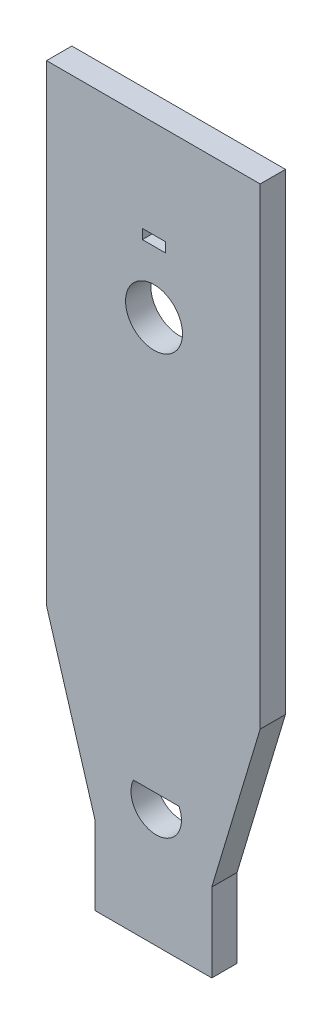
ISO-10303-21;
HEADER;
FILE_DESCRIPTION(('STEP AP214'),'2;1');
FILE_NAME('part.step','',(''),(''),'','','');
FILE_SCHEMA(('AUTOMOTIVE_DESIGN { 1 0 10303 214 1 1 1 1 }'));
ENDSEC;
DATA;
#1=APPLICATION_CONTEXT('core data for automotive mechanical design processes');
#2=APPLICATION_PROTOCOL_DEFINITION('international standard','automotive_design',2000,#1);
#3=PRODUCT_CONTEXT('',#1,'mechanical');
#4=PRODUCT('Part','Part','',(#3));
#5=PRODUCT_RELATED_PRODUCT_CATEGORY('part','',(#4));
#6=PRODUCT_DEFINITION_FORMATION('','',#4);
#7=PRODUCT_DEFINITION_CONTEXT('part definition',#1,'design');
#8=PRODUCT_DEFINITION('design','',#6,#7);
#9=PRODUCT_DEFINITION_SHAPE('','',#8);
#10=(LENGTH_UNIT() NAMED_UNIT(*) SI_UNIT(.MILLI.,.METRE.));
#11=(NAMED_UNIT(*) PLANE_ANGLE_UNIT() SI_UNIT($,.RADIAN.));
#12=(NAMED_UNIT(*) SI_UNIT($,.STERADIAN.) SOLID_ANGLE_UNIT());
#13=UNCERTAINTY_MEASURE_WITH_UNIT(LENGTH_MEASURE(1.E-05),#10,'distance_accuracy_value','');
#14=(GEOMETRIC_REPRESENTATION_CONTEXT(3) GLOBAL_UNCERTAINTY_ASSIGNED_CONTEXT((#13)) GLOBAL_UNIT_ASSIGNED_CONTEXT((#10,
#11,#12)) REPRESENTATION_CONTEXT('',''));
#15=CARTESIAN_POINT('',(0.,0.,0.));
#16=DIRECTION('',(0.,0.,1.));
#17=DIRECTION('',(1.,0.,0.));
#18=AXIS2_PLACEMENT_3D('',#15,#16,#17);
#19=CARTESIAN_POINT('',(0.,0.,0.));
#20=DIRECTION('',(0.,0.,1.));
#21=DIRECTION('',(1.,0.,0.));
#22=AXIS2_PLACEMENT_3D('',#19,#20,#21);
#23=PLANE('',#22);
#24=CARTESIAN_POINT('',(-356.8563,181.549003721827,0.));
#25=DIRECTION('',(0.,0.,1.));
#26=DIRECTION('',(1.,0.,0.));
#27=AXIS2_PLACEMENT_3D('',#24,#25,#26);
#28=CIRCLE('',#27,2.99300991085732);
#29=CARTESIAN_POINT('',(-354.1563,182.84055640232,0.));
#30=VERTEX_POINT('',#29);
#31=CARTESIAN_POINT('',(-359.5563,182.84055640232,0.));
#32=VERTEX_POINT('',#31);
#33=EDGE_CURVE('E209',#30,#32,#28,.F.);
#34=ORIENTED_EDGE('',*,*,#33,.F.);
#35=DIRECTION('',(1.,0.,0.));
#36=VECTOR('',#35,1.);
#37=CARTESIAN_POINT('',(0.,182.84055640232,0.));
#38=LINE('',#37,#36);
#39=EDGE_CURVE('E207',#32,#30,#38,.T.);
#40=ORIENTED_EDGE('',*,*,#39,.F.);
#41=EDGE_LOOP('',(#34,#40));
#42=FACE_BOUND('',#41,.T.);
#43=CARTESIAN_POINT('',(-357.117541936033,231.555994220096,0.));
#44=DIRECTION('',(0.,0.,1.));
#45=DIRECTION('',(1.,0.,0.));
#46=AXIS2_PLACEMENT_3D('',#43,#44,#45);
#47=CIRCLE('',#46,3.37500000000001);
#48=CARTESIAN_POINT('',(-353.742541936033,231.555994220096,0.));
#49=VERTEX_POINT('',#48);
#50=EDGE_CURVE('E212',#49,#49,#47,.T.);
#51=ORIENTED_EDGE('',*,*,#50,.T.);
#52=EDGE_LOOP('',(#51));
#53=FACE_BOUND('',#52,.T.);
#54=DIRECTION('',(0.,-1.,0.));
#55=VECTOR('',#54,1.);
#56=CARTESIAN_POINT('',(-350.267177449582,2.08209436882162E-12,0.));
#57=LINE('',#56,#55);
#58=CARTESIAN_POINT('',(-350.267177449581,176.492478394456,0.));
#59=VERTEX_POINT('',#58);
#60=CARTESIAN_POINT('',(-350.267177449581,167.153932289193,0.));
#61=VERTEX_POINT('',#60);
#62=EDGE_CURVE('E243',#59,#61,#57,.T.);
#63=ORIENTED_EDGE('',*,*,#62,.T.);
#64=DIRECTION('',(1.,0.,0.));
#65=VECTOR('',#64,1.);
#66=CARTESIAN_POINT('',(0.,167.153932289193,0.));
#67=LINE('',#66,#65);
#68=CARTESIAN_POINT('',(-364.123724325274,167.153932289193,0.));
#69=VERTEX_POINT('',#68);
#70=EDGE_CURVE('E217',#69,#61,#67,.T.);
#71=ORIENTED_EDGE('',*,*,#70,.F.);
#72=DIRECTION('',(0.,-1.,0.));
#73=VECTOR('',#72,1.);
#74=CARTESIAN_POINT('',(-364.123724325274,0.,0.));
#75=LINE('',#74,#73);
#76=CARTESIAN_POINT('',(-364.123724325274,176.492478394456,0.));
#77=VERTEX_POINT('',#76);
#78=EDGE_CURVE('E261',#77,#69,#75,.T.);
#79=ORIENTED_EDGE('',*,*,#78,.F.);
#80=DIRECTION('',(-0.287809224056428,0.957687762555227,0.));
#81=VECTOR('',#80,1.);
#82=CARTESIAN_POINT('',(-285.314981388082,-85.7443173189158,0.));
#83=LINE('',#82,#81);
#84=CARTESIAN_POINT('',(-369.858869661342,195.57622570254,0.));
#85=VERTEX_POINT('',#84);
#86=EDGE_CURVE('E258',#77,#85,#83,.T.);
#87=ORIENTED_EDGE('',*,*,#86,.T.);
#88=DIRECTION('',(0.,1.,0.));
#89=VECTOR('',#88,1.);
#90=CARTESIAN_POINT('',(-369.858869661342,0.,0.));
#91=LINE('',#90,#89);
#92=CARTESIAN_POINT('',(-369.858869661342,251.555994220096,0.));
#93=VERTEX_POINT('',#92);
#94=EDGE_CURVE('E255',#85,#93,#91,.T.);
#95=ORIENTED_EDGE('',*,*,#94,.T.);
#96=DIRECTION('',(1.,0.,0.));
#97=VECTOR('',#96,1.);
#98=CARTESIAN_POINT('',(0.,251.555994220096,0.));
#99=LINE('',#98,#97);
#100=CARTESIAN_POINT('',(-344.532032113513,251.555994220096,0.));
#101=VERTEX_POINT('',#100);
#102=EDGE_CURVE('E252',#93,#101,#99,.T.);
#103=ORIENTED_EDGE('',*,*,#102,.T.);
#104=DIRECTION('',(0.,-1.,0.));
#105=VECTOR('',#104,1.);
#106=CARTESIAN_POINT('',(-344.532032113513,0.,0.));
#107=LINE('',#106,#105);
#108=CARTESIAN_POINT('',(-344.532032113513,195.57622570254,0.));
#109=VERTEX_POINT('',#108);
#110=EDGE_CURVE('E249',#101,#109,#107,.T.);
#111=ORIENTED_EDGE('',*,*,#110,.T.);
#112=DIRECTION('',(-0.287809224056425,-0.957687762555228,0.));
#113=VECTOR('',#112,1.);
#114=CARTESIAN_POINT('',(-369.899957662033,111.164226959697,0.));
#115=LINE('',#114,#113);
#116=EDGE_CURVE('E246',#109,#59,#115,.T.);
#117=ORIENTED_EDGE('',*,*,#116,.T.);
#118=EDGE_LOOP('',(#63,#71,#79,#87,#95,#103,#111,#117));
#119=FACE_BOUND('',#118,.T.);
#120=DIRECTION('',(0.,1.,0.));
#121=VECTOR('',#120,1.);
#122=CARTESIAN_POINT('',(-358.497541936033,0.,0.));
#123=LINE('',#122,#121);
#124=CARTESIAN_POINT('',(-358.497541936033,238.859089806921,0.));
#125=VERTEX_POINT('',#124);
#126=CARTESIAN_POINT('',(-358.497541936033,240.009089806921,0.));
#127=VERTEX_POINT('',#126);
#128=EDGE_CURVE('E195',#125,#127,#123,.T.);
#129=ORIENTED_EDGE('',*,*,#128,.F.);
#130=DIRECTION('',(-1.,0.,0.));
#131=VECTOR('',#130,1.);
#132=CARTESIAN_POINT('',(0.,238.859089806921,0.));
#133=LINE('',#132,#131);
#134=CARTESIAN_POINT('',(-355.737541936033,238.859089806921,0.));
#135=VERTEX_POINT('',#134);
#136=EDGE_CURVE('E176',#135,#125,#133,.T.);
#137=ORIENTED_EDGE('',*,*,#136,.F.);
#138=DIRECTION('',(0.,-1.,0.));
#139=VECTOR('',#138,1.);
#140=CARTESIAN_POINT('',(-355.737541936033,0.,0.));
#141=LINE('',#140,#139);
#142=CARTESIAN_POINT('',(-355.737541936033,240.009089806921,0.));
#143=VERTEX_POINT('',#142);
#144=EDGE_CURVE('E192',#143,#135,#141,.T.);
#145=ORIENTED_EDGE('',*,*,#144,.F.);
#146=DIRECTION('',(1.,0.,0.));
#147=VECTOR('',#146,1.);
#148=CARTESIAN_POINT('',(0.,240.009089806921,0.));
#149=LINE('',#148,#147);
#150=EDGE_CURVE('E177',#127,#143,#149,.T.);
#151=ORIENTED_EDGE('',*,*,#150,.F.);
#152=EDGE_LOOP('',(#129,#137,#145,#151));
#153=FACE_BOUND('',#152,.T.);
#154=ADVANCED_FACE('F62',(#42,#53,#119,#153),#23,.F.);
#155=CARTESIAN_POINT('',(0.,0.,3.));
#156=DIRECTION('',(0.,0.,1.));
#157=DIRECTION('',(1.,0.,0.));
#158=AXIS2_PLACEMENT_3D('',#155,#156,#157);
#159=PLANE('',#158);
#160=DIRECTION('',(-1.,0.,0.));
#161=VECTOR('',#160,1.);
#162=CARTESIAN_POINT('',(-359.5563,182.84055640232,3.));
#163=LINE('',#162,#161);
#164=CARTESIAN_POINT('',(-354.1563,182.84055640232,3.));
#165=VERTEX_POINT('',#164);
#166=CARTESIAN_POINT('',(-359.5563,182.84055640232,3.));
#167=VERTEX_POINT('',#166);
#168=EDGE_CURVE('E200',#165,#167,#163,.T.);
#169=ORIENTED_EDGE('',*,*,#168,.F.);
#170=CARTESIAN_POINT('',(-356.8563,181.549003721827,3.));
#171=DIRECTION('',(0.,0.,1.));
#172=DIRECTION('',(1.,0.,0.));
#173=AXIS2_PLACEMENT_3D('',#170,#171,#172);
#174=CIRCLE('',#173,2.99300991085732);
#175=EDGE_CURVE('E197',#167,#165,#174,.T.);
#176=ORIENTED_EDGE('',*,*,#175,.F.);
#177=EDGE_LOOP('',(#169,#176));
#178=FACE_BOUND('',#177,.T.);
#179=CARTESIAN_POINT('',(-357.117541936033,231.555994220096,3.));
#180=DIRECTION('',(0.,0.,1.));
#181=DIRECTION('',(1.,0.,0.));
#182=AXIS2_PLACEMENT_3D('',#179,#180,#181);
#183=CIRCLE('',#182,3.37500000000001);
#184=CARTESIAN_POINT('',(-353.742541936033,231.555994220096,3.));
#185=VERTEX_POINT('',#184);
#186=EDGE_CURVE('E213',#185,#185,#183,.T.);
#187=ORIENTED_EDGE('',*,*,#186,.F.);
#188=EDGE_LOOP('',(#187));
#189=FACE_BOUND('',#188,.T.);
#190=DIRECTION('',(0.,-1.,0.));
#191=VECTOR('',#190,1.);
#192=CARTESIAN_POINT('',(-350.267177449582,2.08209436882162E-12,3.));
#193=LINE('',#192,#191);
#194=CARTESIAN_POINT('',(-350.267177449581,176.492478394456,3.));
#195=VERTEX_POINT('',#194);
#196=CARTESIAN_POINT('',(-350.267177449581,167.153932289193,3.));
#197=VERTEX_POINT('',#196);
#198=EDGE_CURVE('E216',#195,#197,#193,.T.);
#199=ORIENTED_EDGE('',*,*,#198,.F.);
#200=DIRECTION('',(-0.287809224056425,-0.957687762555228,0.));
#201=VECTOR('',#200,1.);
#202=CARTESIAN_POINT('',(-369.899957662033,111.164226959697,3.));
#203=LINE('',#202,#201);
#204=CARTESIAN_POINT('',(-344.532032113513,195.57622570254,3.));
#205=VERTEX_POINT('',#204);
#206=EDGE_CURVE('E220',#205,#195,#203,.T.);
#207=ORIENTED_EDGE('',*,*,#206,.F.);
#208=DIRECTION('',(0.,-1.,0.));
#209=VECTOR('',#208,1.);
#210=CARTESIAN_POINT('',(-344.532032113513,0.,3.));
#211=LINE('',#210,#209);
#212=CARTESIAN_POINT('',(-344.532032113513,251.555994220096,3.));
#213=VERTEX_POINT('',#212);
#214=EDGE_CURVE('E223',#213,#205,#211,.T.);
#215=ORIENTED_EDGE('',*,*,#214,.F.);
#216=DIRECTION('',(1.,0.,0.));
#217=VECTOR('',#216,1.);
#218=CARTESIAN_POINT('',(0.,251.555994220096,3.));
#219=LINE('',#218,#217);
#220=CARTESIAN_POINT('',(-369.858869661342,251.555994220096,3.));
#221=VERTEX_POINT('',#220);
#222=EDGE_CURVE('E226',#221,#213,#219,.T.);
#223=ORIENTED_EDGE('',*,*,#222,.F.);
#224=DIRECTION('',(0.,1.,0.));
#225=VECTOR('',#224,1.);
#226=CARTESIAN_POINT('',(-369.858869661342,0.,3.));
#227=LINE('',#226,#225);
#228=CARTESIAN_POINT('',(-369.858869661342,195.57622570254,3.));
#229=VERTEX_POINT('',#228);
#230=EDGE_CURVE('E229',#229,#221,#227,.T.);
#231=ORIENTED_EDGE('',*,*,#230,.F.);
#232=DIRECTION('',(-0.287809224056428,0.957687762555227,0.));
#233=VECTOR('',#232,1.);
#234=CARTESIAN_POINT('',(-285.314981388082,-85.7443173189158,3.));
#235=LINE('',#234,#233);
#236=CARTESIAN_POINT('',(-364.123724325274,176.492478394456,3.));
#237=VERTEX_POINT('',#236);
#238=EDGE_CURVE('E232',#237,#229,#235,.T.);
#239=ORIENTED_EDGE('',*,*,#238,.F.);
#240=DIRECTION('',(0.,-1.,0.));
#241=VECTOR('',#240,1.);
#242=CARTESIAN_POINT('',(-364.123724325274,0.,3.));
#243=LINE('',#242,#241);
#244=CARTESIAN_POINT('',(-364.123724325274,167.153932289193,3.));
#245=VERTEX_POINT('',#244);
#246=EDGE_CURVE('E235',#237,#245,#243,.T.);
#247=ORIENTED_EDGE('',*,*,#246,.T.);
#248=DIRECTION('',(1.,0.,0.));
#249=VECTOR('',#248,1.);
#250=CARTESIAN_POINT('',(0.,167.153932289193,3.));
#251=LINE('',#250,#249);
#252=EDGE_CURVE('E238',#245,#197,#251,.T.);
#253=ORIENTED_EDGE('',*,*,#252,.T.);
#254=EDGE_LOOP('',(#199,#207,#215,#223,#231,#239,#247,#253));
#255=FACE_BOUND('',#254,.T.);
#256=DIRECTION('',(1.,0.,0.));
#257=VECTOR('',#256,1.);
#258=CARTESIAN_POINT('',(-358.497541936033,238.859089806921,3.));
#259=LINE('',#258,#257);
#260=CARTESIAN_POINT('',(-358.497541936033,238.859089806921,3.));
#261=VERTEX_POINT('',#260);
#262=CARTESIAN_POINT('',(-355.737541936033,238.859089806921,3.));
#263=VERTEX_POINT('',#262);
#264=EDGE_CURVE('E169',#261,#263,#259,.T.);
#265=ORIENTED_EDGE('',*,*,#264,.F.);
#266=DIRECTION('',(0.,-1.,0.));
#267=VECTOR('',#266,1.);
#268=CARTESIAN_POINT('',(-358.497541936033,238.859089806921,3.));
#269=LINE('',#268,#267);
#270=CARTESIAN_POINT('',(-358.497541936033,240.009089806921,3.));
#271=VERTEX_POINT('',#270);
#272=EDGE_CURVE('E161',#271,#261,#269,.T.);
#273=ORIENTED_EDGE('',*,*,#272,.F.);
#274=DIRECTION('',(-1.,0.,0.));
#275=VECTOR('',#274,1.);
#276=CARTESIAN_POINT('',(-358.497541936033,240.009089806921,3.));
#277=LINE('',#276,#275);
#278=CARTESIAN_POINT('',(-355.737541936033,240.009089806921,3.));
#279=VERTEX_POINT('',#278);
#280=EDGE_CURVE('E184',#279,#271,#277,.T.);
#281=ORIENTED_EDGE('',*,*,#280,.F.);
#282=DIRECTION('',(0.,1.,0.));
#283=VECTOR('',#282,1.);
#284=CARTESIAN_POINT('',(-355.737541936033,238.859089806921,3.));
#285=LINE('',#284,#283);
#286=EDGE_CURVE('E182',#263,#279,#285,.T.);
#287=ORIENTED_EDGE('',*,*,#286,.F.);
#288=EDGE_LOOP('',(#265,#273,#281,#287));
#289=FACE_BOUND('',#288,.T.);
#290=ADVANCED_FACE('F181',(#178,#189,#255,#289),#159,.T.);
#291=CARTESIAN_POINT('',(-369.899957662033,111.164226959697,3.));
#292=DIRECTION('',(0.957687762555228,-0.287809224056425,0.));
#293=DIRECTION('',(0.287809224056425,0.957687762555228,0.));
#294=AXIS2_PLACEMENT_3D('',#291,#292,#293);
#295=PLANE('',#294);
#296=ORIENTED_EDGE('',*,*,#116,.F.);
#297=DIRECTION('',(0.,0.,-1.));
#298=VECTOR('',#297,1.);
#299=CARTESIAN_POINT('',(-344.532032113513,195.57622570254,3.));
#300=LINE('',#299,#298);
#301=EDGE_CURVE('E70',#205,#109,#300,.T.);
#302=ORIENTED_EDGE('',*,*,#301,.F.);
#303=ORIENTED_EDGE('',*,*,#206,.T.);
#304=DIRECTION('',(0.,0.,-1.));
#305=VECTOR('',#304,1.);
#306=CARTESIAN_POINT('',(-350.267177449581,176.492478394456,3.));
#307=LINE('',#306,#305);
#308=EDGE_CURVE('E12',#195,#59,#307,.T.);
#309=ORIENTED_EDGE('',*,*,#308,.T.);
#310=EDGE_LOOP('',(#296,#302,#303,#309));
#311=FACE_BOUND('',#310,.T.);
#312=ADVANCED_FACE('F284',(#311),#295,.T.);
#313=CARTESIAN_POINT('',(-344.532032113513,0.,3.));
#314=DIRECTION('',(1.,0.,0.));
#315=DIRECTION('',(0.,0.,-1.));
#316=AXIS2_PLACEMENT_3D('',#313,#314,#315);
#317=PLANE('',#316);
#318=ORIENTED_EDGE('',*,*,#110,.F.);
#319=DIRECTION('',(0.,0.,-1.));
#320=VECTOR('',#319,1.);
#321=CARTESIAN_POINT('',(-344.532032113513,251.555994220096,3.));
#322=LINE('',#321,#320);
#323=EDGE_CURVE('E276',#213,#101,#322,.T.);
#324=ORIENTED_EDGE('',*,*,#323,.F.);
#325=ORIENTED_EDGE('',*,*,#214,.T.);
#326=ORIENTED_EDGE('',*,*,#301,.T.);
#327=EDGE_LOOP('',(#318,#324,#325,#326));
#328=FACE_BOUND('',#327,.T.);
#329=ADVANCED_FACE('F280',(#328),#317,.T.);
#330=CARTESIAN_POINT('',(0.,251.555994220096,3.));
#331=DIRECTION('',(0.,1.,0.));
#332=DIRECTION('',(0.,0.,1.));
#333=AXIS2_PLACEMENT_3D('',#330,#331,#332);
#334=PLANE('',#333);
#335=ORIENTED_EDGE('',*,*,#102,.F.);
#336=DIRECTION('',(0.,0.,-1.));
#337=VECTOR('',#336,1.);
#338=CARTESIAN_POINT('',(-369.858869661342,251.555994220096,3.));
#339=LINE('',#338,#337);
#340=EDGE_CURVE('E274',#221,#93,#339,.T.);
#341=ORIENTED_EDGE('',*,*,#340,.F.);
#342=ORIENTED_EDGE('',*,*,#222,.T.);
#343=ORIENTED_EDGE('',*,*,#323,.T.);
#344=EDGE_LOOP('',(#335,#341,#342,#343));
#345=FACE_BOUND('',#344,.T.);
#346=ADVANCED_FACE('F291',(#345),#334,.T.);
#347=CARTESIAN_POINT('',(-369.858869661342,0.,3.));
#348=DIRECTION('',(-1.,0.,0.));
#349=DIRECTION('',(0.,0.,1.));
#350=AXIS2_PLACEMENT_3D('',#347,#348,#349);
#351=PLANE('',#350);
#352=ORIENTED_EDGE('',*,*,#94,.F.);
#353=DIRECTION('',(0.,0.,-1.));
#354=VECTOR('',#353,1.);
#355=CARTESIAN_POINT('',(-369.858869661342,195.57622570254,3.));
#356=LINE('',#355,#354);
#357=EDGE_CURVE('E272',#229,#85,#356,.T.);
#358=ORIENTED_EDGE('',*,*,#357,.F.);
#359=ORIENTED_EDGE('',*,*,#230,.T.);
#360=ORIENTED_EDGE('',*,*,#340,.T.);
#361=EDGE_LOOP('',(#352,#358,#359,#360));
#362=FACE_BOUND('',#361,.T.);
#363=ADVANCED_FACE('F311',(#362),#351,.T.);
#364=CARTESIAN_POINT('',(-285.314981388082,-85.7443173189158,3.));
#365=DIRECTION('',(-0.957687762555227,-0.287809224056428,0.));
#366=DIRECTION('',(0.287809224056428,-0.957687762555227,0.));
#367=AXIS2_PLACEMENT_3D('',#364,#365,#366);
#368=PLANE('',#367);
#369=ORIENTED_EDGE('',*,*,#86,.F.);
#370=DIRECTION('',(0.,0.,-1.));
#371=VECTOR('',#370,1.);
#372=CARTESIAN_POINT('',(-364.123724325274,176.492478394456,3.));
#373=LINE('',#372,#371);
#374=EDGE_CURVE('E270',#237,#77,#373,.T.);
#375=ORIENTED_EDGE('',*,*,#374,.F.);
#376=ORIENTED_EDGE('',*,*,#238,.T.);
#377=ORIENTED_EDGE('',*,*,#357,.T.);
#378=EDGE_LOOP('',(#369,#375,#376,#377));
#379=FACE_BOUND('',#378,.T.);
#380=ADVANCED_FACE('F309',(#379),#368,.T.);
#381=CARTESIAN_POINT('',(-364.123724325274,0.,3.));
#382=DIRECTION('',(1.,0.,0.));
#383=DIRECTION('',(0.,0.,-1.));
#384=AXIS2_PLACEMENT_3D('',#381,#382,#383);
#385=PLANE('',#384);
#386=ORIENTED_EDGE('',*,*,#78,.T.);
#387=DIRECTION('',(0.,0.,-1.));
#388=VECTOR('',#387,1.);
#389=CARTESIAN_POINT('',(-364.123724325274,167.153932289193,3.));
#390=LINE('',#389,#388);
#391=EDGE_CURVE('E267',#245,#69,#390,.T.);
#392=ORIENTED_EDGE('',*,*,#391,.F.);
#393=ORIENTED_EDGE('',*,*,#246,.F.);
#394=ORIENTED_EDGE('',*,*,#374,.T.);
#395=EDGE_LOOP('',(#386,#392,#393,#394));
#396=FACE_BOUND('',#395,.T.);
#397=ADVANCED_FACE('F306',(#396),#385,.F.);
#398=CARTESIAN_POINT('',(0.,167.153932289193,3.));
#399=DIRECTION('',(0.,1.,0.));
#400=DIRECTION('',(0.,0.,1.));
#401=AXIS2_PLACEMENT_3D('',#398,#399,#400);
#402=PLANE('',#401);
#403=ORIENTED_EDGE('',*,*,#70,.T.);
#404=DIRECTION('',(0.,0.,-1.));
#405=VECTOR('',#404,1.);
#406=CARTESIAN_POINT('',(-350.267177449581,167.153932289193,3.));
#407=LINE('',#406,#405);
#408=EDGE_CURVE('E240',#197,#61,#407,.T.);
#409=ORIENTED_EDGE('',*,*,#408,.F.);
#410=ORIENTED_EDGE('',*,*,#252,.F.);
#411=ORIENTED_EDGE('',*,*,#391,.T.);
#412=EDGE_LOOP('',(#403,#409,#410,#411));
#413=FACE_BOUND('',#412,.T.);
#414=ADVANCED_FACE('F303',(#413),#402,.F.);
#415=CARTESIAN_POINT('',(-350.267177449582,2.08209436882162E-12,3.));
#416=DIRECTION('',(1.,0.,0.));
#417=DIRECTION('',(0.,1.,0.));
#418=AXIS2_PLACEMENT_3D('',#415,#416,#417);
#419=PLANE('',#418);
#420=ORIENTED_EDGE('',*,*,#62,.F.);
#421=ORIENTED_EDGE('',*,*,#308,.F.);
#422=ORIENTED_EDGE('',*,*,#198,.T.);
#423=ORIENTED_EDGE('',*,*,#408,.T.);
#424=EDGE_LOOP('',(#420,#421,#422,#423));
#425=FACE_BOUND('',#424,.T.);
#426=ADVANCED_FACE('F298',(#425),#419,.T.);
#427=CARTESIAN_POINT('',(-357.117541936033,231.555994220096,3.));
#428=DIRECTION('',(0.,0.,-1.));
#429=DIRECTION('',(-1.,0.,0.));
#430=AXIS2_PLACEMENT_3D('',#427,#428,#429);
#431=CYLINDRICAL_SURFACE('',#430,3.37500000000001);
#432=ORIENTED_EDGE('',*,*,#186,.T.);
#433=EDGE_LOOP('',(#432));
#434=FACE_BOUND('',#433,.T.);
#435=ORIENTED_EDGE('',*,*,#50,.F.);
#436=EDGE_LOOP('',(#435));
#437=FACE_BOUND('',#436,.T.);
#438=ADVANCED_FACE('F64',(#434,#437),#431,.F.);
#439=CARTESIAN_POINT('',(-356.8563,181.549003721827,3.));
#440=DIRECTION('',(0.,0.,-1.));
#441=DIRECTION('',(-1.,0.,0.));
#442=AXIS2_PLACEMENT_3D('',#439,#440,#441);
#443=CYLINDRICAL_SURFACE('',#442,2.99300991085732);
#444=ORIENTED_EDGE('',*,*,#33,.T.);
#445=DIRECTION('',(0.,0.,-1.));
#446=VECTOR('',#445,1.);
#447=CARTESIAN_POINT('',(-359.5563,182.84055640232,3.));
#448=LINE('',#447,#446);
#449=EDGE_CURVE('E202',#167,#32,#448,.T.);
#450=ORIENTED_EDGE('',*,*,#449,.F.);
#451=ORIENTED_EDGE('',*,*,#175,.T.);
#452=DIRECTION('',(0.,0.,-1.));
#453=VECTOR('',#452,1.);
#454=CARTESIAN_POINT('',(-354.1563,182.84055640232,3.));
#455=LINE('',#454,#453);
#456=EDGE_CURVE('E204',#165,#30,#455,.T.);
#457=ORIENTED_EDGE('',*,*,#456,.T.);
#458=EDGE_LOOP('',(#444,#450,#451,#457));
#459=FACE_BOUND('',#458,.T.);
#460=ADVANCED_FACE('F354',(#459),#443,.F.);
#461=CARTESIAN_POINT('',(-359.5563,182.84055640232,3.));
#462=DIRECTION('',(0.,-1.,0.));
#463=DIRECTION('',(0.,0.,-1.));
#464=AXIS2_PLACEMENT_3D('',#461,#462,#463);
#465=PLANE('',#464);
#466=ORIENTED_EDGE('',*,*,#39,.T.);
#467=ORIENTED_EDGE('',*,*,#456,.F.);
#468=ORIENTED_EDGE('',*,*,#168,.T.);
#469=ORIENTED_EDGE('',*,*,#449,.T.);
#470=EDGE_LOOP('',(#466,#467,#468,#469));
#471=FACE_BOUND('',#470,.T.);
#472=ADVANCED_FACE('F361',(#471),#465,.T.);
#473=CARTESIAN_POINT('',(-358.497541936033,238.859089806921,3.));
#474=DIRECTION('',(1.,0.,0.));
#475=DIRECTION('',(0.,0.,-1.));
#476=AXIS2_PLACEMENT_3D('',#473,#474,#475);
#477=PLANE('',#476);
#478=ORIENTED_EDGE('',*,*,#128,.T.);
#479=DIRECTION('',(0.,0.,-1.));
#480=VECTOR('',#479,1.);
#481=CARTESIAN_POINT('',(-358.497541936033,240.009089806921,3.));
#482=LINE('',#481,#480);
#483=EDGE_CURVE('E77',#271,#127,#482,.T.);
#484=ORIENTED_EDGE('',*,*,#483,.F.);
#485=ORIENTED_EDGE('',*,*,#272,.T.);
#486=DIRECTION('',(0.,0.,-1.));
#487=VECTOR('',#486,1.);
#488=CARTESIAN_POINT('',(-358.497541936033,238.859089806921,3.));
#489=LINE('',#488,#487);
#490=EDGE_CURVE('E164',#261,#125,#489,.T.);
#491=ORIENTED_EDGE('',*,*,#490,.T.);
#492=EDGE_LOOP('',(#478,#484,#485,#491));
#493=FACE_BOUND('',#492,.T.);
#494=ADVANCED_FACE('F163',(#493),#477,.T.);
#495=CARTESIAN_POINT('',(-358.497541936033,238.859089806921,3.));
#496=DIRECTION('',(0.,1.,0.));
#497=DIRECTION('',(0.,0.,1.));
#498=AXIS2_PLACEMENT_3D('',#495,#496,#497);
#499=PLANE('',#498);
#500=ORIENTED_EDGE('',*,*,#136,.T.);
#501=ORIENTED_EDGE('',*,*,#490,.F.);
#502=ORIENTED_EDGE('',*,*,#264,.T.);
#503=DIRECTION('',(0.,0.,-1.));
#504=VECTOR('',#503,1.);
#505=CARTESIAN_POINT('',(-355.737541936033,238.859089806921,3.));
#506=LINE('',#505,#504);
#507=EDGE_CURVE('E178',#263,#135,#506,.T.);
#508=ORIENTED_EDGE('',*,*,#507,.T.);
#509=EDGE_LOOP('',(#500,#501,#502,#508));
#510=FACE_BOUND('',#509,.T.);
#511=ADVANCED_FACE('F172',(#510),#499,.T.);
#512=CARTESIAN_POINT('',(-355.737541936033,238.859089806921,3.));
#513=DIRECTION('',(-1.,0.,0.));
#514=DIRECTION('',(0.,0.,1.));
#515=AXIS2_PLACEMENT_3D('',#512,#513,#514);
#516=PLANE('',#515);
#517=ORIENTED_EDGE('',*,*,#144,.T.);
#518=ORIENTED_EDGE('',*,*,#507,.F.);
#519=ORIENTED_EDGE('',*,*,#286,.T.);
#520=DIRECTION('',(0.,0.,-1.));
#521=VECTOR('',#520,1.);
#522=CARTESIAN_POINT('',(-355.737541936033,240.009089806921,3.));
#523=LINE('',#522,#521);
#524=EDGE_CURVE('E82',#279,#143,#523,.T.);
#525=ORIENTED_EDGE('',*,*,#524,.T.);
#526=EDGE_LOOP('',(#517,#518,#519,#525));
#527=FACE_BOUND('',#526,.T.);
#528=ADVANCED_FACE('F382',(#527),#516,.T.);
#529=CARTESIAN_POINT('',(-358.497541936033,240.009089806921,3.));
#530=DIRECTION('',(0.,-1.,0.));
#531=DIRECTION('',(0.,0.,-1.));
#532=AXIS2_PLACEMENT_3D('',#529,#530,#531);
#533=PLANE('',#532);
#534=ORIENTED_EDGE('',*,*,#150,.T.);
#535=ORIENTED_EDGE('',*,*,#524,.F.);
#536=ORIENTED_EDGE('',*,*,#280,.T.);
#537=ORIENTED_EDGE('',*,*,#483,.T.);
#538=EDGE_LOOP('',(#534,#535,#536,#537));
#539=FACE_BOUND('',#538,.T.);
#540=ADVANCED_FACE('F389',(#539),#533,.T.);
#541=CLOSED_SHELL('',(#154,#290,#312,#329,#346,#363,#380,#397,#414,#426,#438,#460,#472,#494,
#511,#528,#540));
#542=MANIFOLD_SOLID_BREP('B2',#541);
#543=ADVANCED_BREP_SHAPE_REPRESENTATION('',(#18,#542),#14);
#544=SHAPE_DEFINITION_REPRESENTATION(#9,#543);
ENDSEC;
END-ISO-10303-21;
